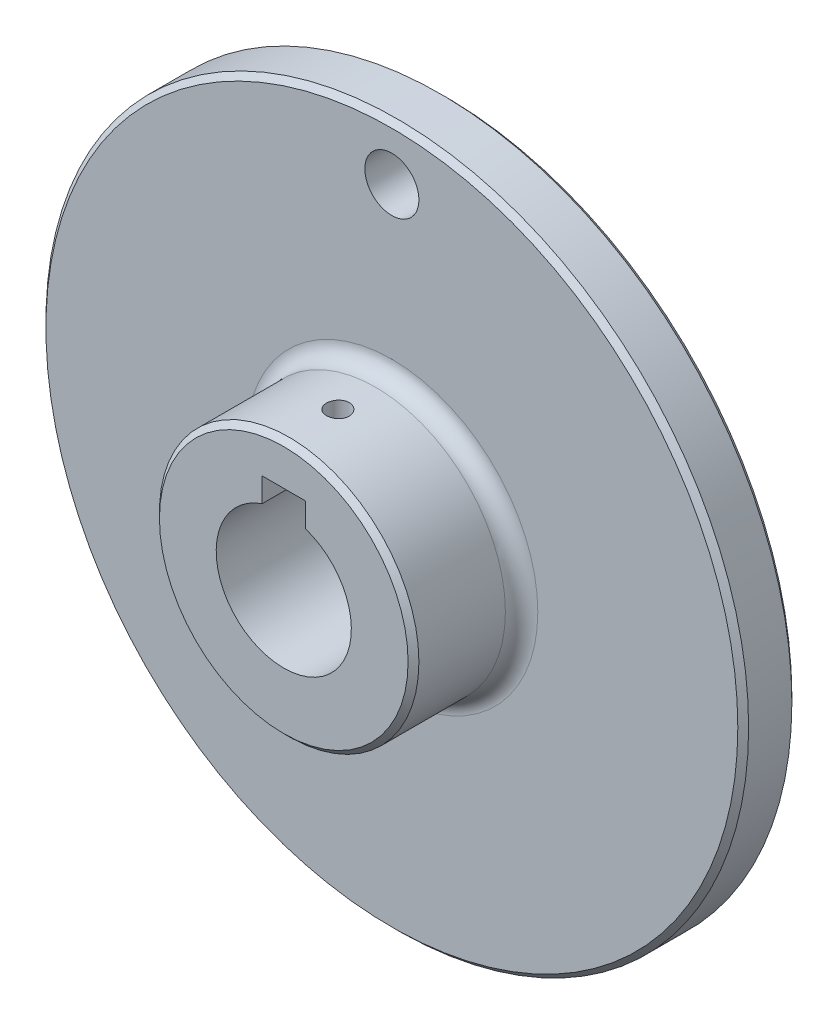
ISO-10303-21;
HEADER;
FILE_DESCRIPTION(('STEP AP214'),'2;1');
FILE_NAME('part.step','',(''),(''),'','','');
FILE_SCHEMA(('AUTOMOTIVE_DESIGN { 1 0 10303 214 1 1 1 1 }'));
ENDSEC;
DATA;
#1=APPLICATION_CONTEXT('core data for automotive mechanical design processes');
#2=APPLICATION_PROTOCOL_DEFINITION('international standard','automotive_design',2000,#1);
#3=PRODUCT_CONTEXT('',#1,'mechanical');
#4=PRODUCT('Part','Part','',(#3));
#5=PRODUCT_RELATED_PRODUCT_CATEGORY('part','',(#4));
#6=PRODUCT_DEFINITION_FORMATION('','',#4);
#7=PRODUCT_DEFINITION_CONTEXT('part definition',#1,'design');
#8=PRODUCT_DEFINITION('design','',#6,#7);
#9=PRODUCT_DEFINITION_SHAPE('','',#8);
#10=(LENGTH_UNIT() NAMED_UNIT(*) SI_UNIT(.MILLI.,.METRE.));
#11=(NAMED_UNIT(*) PLANE_ANGLE_UNIT() SI_UNIT($,.RADIAN.));
#12=(NAMED_UNIT(*) SI_UNIT($,.STERADIAN.) SOLID_ANGLE_UNIT());
#13=UNCERTAINTY_MEASURE_WITH_UNIT(LENGTH_MEASURE(1.E-05),#10,'distance_accuracy_value','');
#14=(GEOMETRIC_REPRESENTATION_CONTEXT(3) GLOBAL_UNCERTAINTY_ASSIGNED_CONTEXT((#13)) GLOBAL_UNIT_ASSIGNED_CONTEXT((#10,
#11,#12)) REPRESENTATION_CONTEXT('',''));
#15=CARTESIAN_POINT('',(0.,0.,0.));
#16=DIRECTION('',(0.,0.,1.));
#17=DIRECTION('',(1.,0.,0.));
#18=AXIS2_PLACEMENT_3D('',#15,#16,#17);
#19=CARTESIAN_POINT('',(0.,0.,10.));
#20=DIRECTION('',(0.,0.,1.));
#21=DIRECTION('',(1.,0.,0.));
#22=AXIS2_PLACEMENT_3D('',#19,#20,#21);
#23=PLANE('',#22);
#24=CARTESIAN_POINT('',(0.,0.,10.));
#25=DIRECTION('',(0.,0.,1.));
#26=DIRECTION('',(1.,0.,0.));
#27=AXIS2_PLACEMENT_3D('',#24,#25,#26);
#28=CIRCLE('',#27,27.);
#29=CARTESIAN_POINT('',(27.,0.,10.));
#30=VERTEX_POINT('',#29);
#31=EDGE_CURVE('E138',#30,#30,#28,.F.);
#32=ORIENTED_EDGE('',*,*,#31,.T.);
#33=EDGE_LOOP('',(#32));
#34=FACE_BOUND('',#33,.T.);
#35=CARTESIAN_POINT('',(0.,0.,10.));
#36=DIRECTION('',(0.,0.,1.));
#37=DIRECTION('',(1.,0.,0.));
#38=AXIS2_PLACEMENT_3D('',#35,#36,#37);
#39=CIRCLE('',#38,64.);
#40=CARTESIAN_POINT('',(64.,0.,10.));
#41=VERTEX_POINT('',#40);
#42=EDGE_CURVE('E132',#41,#41,#39,.T.);
#43=ORIENTED_EDGE('',*,*,#42,.T.);
#44=EDGE_LOOP('',(#43));
#45=FACE_BOUND('',#44,.T.);
#46=CARTESIAN_POINT('',(0.,55.,10.));
#47=DIRECTION('',(0.,0.,1.));
#48=DIRECTION('',(1.,0.,0.));
#49=AXIS2_PLACEMENT_3D('',#46,#47,#48);
#50=CIRCLE('',#49,5.);
#51=CARTESIAN_POINT('',(5.,55.,10.));
#52=VERTEX_POINT('',#51);
#53=EDGE_CURVE('E118',#52,#52,#50,.T.);
#54=ORIENTED_EDGE('',*,*,#53,.F.);
#55=EDGE_LOOP('',(#54));
#56=FACE_BOUND('',#55,.T.);
#57=ADVANCED_FACE('F38',(#34,#45,#56),#23,.T.);
#58=CARTESIAN_POINT('',(0.,0.,0.));
#59=DIRECTION('',(0.,0.,1.));
#60=DIRECTION('',(1.,0.,0.));
#61=AXIS2_PLACEMENT_3D('',#58,#59,#60);
#62=PLANE('',#61);
#63=CARTESIAN_POINT('',(0.,0.,0.));
#64=DIRECTION('',(0.,0.,1.));
#65=DIRECTION('',(1.,0.,0.));
#66=AXIS2_PLACEMENT_3D('',#63,#64,#65);
#67=CIRCLE('',#66,64.);
#68=CARTESIAN_POINT('',(64.,0.,0.));
#69=VERTEX_POINT('',#68);
#70=EDGE_CURVE('E129',#69,#69,#67,.F.);
#71=ORIENTED_EDGE('',*,*,#70,.T.);
#72=EDGE_LOOP('',(#71));
#73=FACE_BOUND('',#72,.T.);
#74=CARTESIAN_POINT('',(0.,55.,0.));
#75=DIRECTION('',(0.,0.,1.));
#76=DIRECTION('',(1.,0.,0.));
#77=AXIS2_PLACEMENT_3D('',#74,#75,#76);
#78=CIRCLE('',#77,5.);
#79=CARTESIAN_POINT('',(5.,55.,0.));
#80=VERTEX_POINT('',#79);
#81=EDGE_CURVE('E117',#80,#80,#78,.T.);
#82=ORIENTED_EDGE('',*,*,#81,.T.);
#83=EDGE_LOOP('',(#82));
#84=FACE_BOUND('',#83,.T.);
#85=DIRECTION('',(-1.,0.,0.));
#86=VECTOR('',#85,1.);
#87=CARTESIAN_POINT('',(-4.,16.3,0.));
#88=LINE('',#87,#86);
#89=CARTESIAN_POINT('',(4.,16.3,0.));
#90=VERTEX_POINT('',#89);
#91=CARTESIAN_POINT('',(-4.,16.3,0.));
#92=VERTEX_POINT('',#91);
#93=EDGE_CURVE('E91',#90,#92,#88,.T.);
#94=ORIENTED_EDGE('',*,*,#93,.T.);
#95=DIRECTION('',(0.,-1.,0.));
#96=VECTOR('',#95,1.);
#97=CARTESIAN_POINT('',(-4.,0.,0.));
#98=LINE('',#97,#96);
#99=CARTESIAN_POINT('',(-4.,11.842719282327,0.));
#100=VERTEX_POINT('',#99);
#101=EDGE_CURVE('E101',#92,#100,#98,.T.);
#102=ORIENTED_EDGE('',*,*,#101,.T.);
#103=CARTESIAN_POINT('',(0.,0.,0.));
#104=DIRECTION('',(0.,0.,1.));
#105=DIRECTION('',(1.,0.,0.));
#106=AXIS2_PLACEMENT_3D('',#103,#104,#105);
#107=CIRCLE('',#106,12.5);
#108=CARTESIAN_POINT('',(4.,11.842719282327,0.));
#109=VERTEX_POINT('',#108);
#110=EDGE_CURVE('E100',#100,#109,#107,.T.);
#111=ORIENTED_EDGE('',*,*,#110,.T.);
#112=DIRECTION('',(0.,1.,0.));
#113=VECTOR('',#112,1.);
#114=CARTESIAN_POINT('',(4.,0.,0.));
#115=LINE('',#114,#113);
#116=EDGE_CURVE('E86',#109,#90,#115,.T.);
#117=ORIENTED_EDGE('',*,*,#116,.T.);
#118=EDGE_LOOP('',(#94,#102,#111,#117));
#119=FACE_BOUND('',#118,.T.);
#120=ADVANCED_FACE('F98',(#73,#84,#119),#62,.F.);
#121=CARTESIAN_POINT('',(0.,0.,10.));
#122=DIRECTION('',(0.,0.,-1.));
#123=DIRECTION('',(-1.,0.,0.));
#124=AXIS2_PLACEMENT_3D('',#121,#122,#123);
#125=CYLINDRICAL_SURFACE('',#124,65.);
#126=CARTESIAN_POINT('',(0.,0.,1.));
#127=DIRECTION('',(0.,0.,1.));
#128=DIRECTION('',(1.,0.,0.));
#129=AXIS2_PLACEMENT_3D('',#126,#127,#128);
#130=CIRCLE('',#129,65.);
#131=CARTESIAN_POINT('',(65.,0.,1.));
#132=VERTEX_POINT('',#131);
#133=EDGE_CURVE('E126',#132,#132,#130,.T.);
#134=ORIENTED_EDGE('',*,*,#133,.T.);
#135=EDGE_LOOP('',(#134));
#136=FACE_BOUND('',#135,.T.);
#137=CARTESIAN_POINT('',(0.,0.,8.99999999999997));
#138=DIRECTION('',(0.,0.,1.));
#139=DIRECTION('',(1.,0.,0.));
#140=AXIS2_PLACEMENT_3D('',#137,#138,#139);
#141=CIRCLE('',#140,65.);
#142=CARTESIAN_POINT('',(65.,0.,8.99999999999997));
#143=VERTEX_POINT('',#142);
#144=EDGE_CURVE('E121',#143,#143,#141,.F.);
#145=ORIENTED_EDGE('',*,*,#144,.T.);
#146=EDGE_LOOP('',(#145));
#147=FACE_BOUND('',#146,.T.);
#148=ADVANCED_FACE('F178',(#136,#147),#125,.T.);
#149=CARTESIAN_POINT('',(0.,55.,10.));
#150=DIRECTION('',(0.,0.,-1.));
#151=DIRECTION('',(-1.,0.,0.));
#152=AXIS2_PLACEMENT_3D('',#149,#150,#151);
#153=CYLINDRICAL_SURFACE('',#152,5.);
#154=ORIENTED_EDGE('',*,*,#53,.T.);
#155=EDGE_LOOP('',(#154));
#156=FACE_BOUND('',#155,.T.);
#157=ORIENTED_EDGE('',*,*,#81,.F.);
#158=EDGE_LOOP('',(#157));
#159=FACE_BOUND('',#158,.T.);
#160=ADVANCED_FACE('F167',(#156,#159),#153,.F.);
#161=CARTESIAN_POINT('',(0.,0.,10.));
#162=DIRECTION('',(0.,0.,-1.));
#163=DIRECTION('',(-1.,0.,0.));
#164=AXIS2_PLACEMENT_3D('',#161,#162,#163);
#165=CYLINDRICAL_SURFACE('',#164,12.5);
#166=DIRECTION('',(0.,0.,-1.));
#167=VECTOR('',#166,1.);
#168=CARTESIAN_POINT('',(-4.,11.842719282327,10.));
#169=LINE('',#168,#167);
#170=CARTESIAN_POINT('',(-4.,11.842719282327,30.));
#171=VERTEX_POINT('',#170);
#172=EDGE_CURVE('E65',#171,#100,#169,.T.);
#173=ORIENTED_EDGE('',*,*,#172,.F.);
#174=CARTESIAN_POINT('',(0.,0.,30.));
#175=DIRECTION('',(0.,0.,1.));
#176=DIRECTION('',(1.,0.,0.));
#177=AXIS2_PLACEMENT_3D('',#174,#175,#176);
#178=CIRCLE('',#177,12.5);
#179=CARTESIAN_POINT('',(4.,11.842719282327,30.));
#180=VERTEX_POINT('',#179);
#181=EDGE_CURVE('E113',#171,#180,#178,.T.);
#182=ORIENTED_EDGE('',*,*,#181,.T.);
#183=DIRECTION('',(0.,0.,-1.));
#184=VECTOR('',#183,1.);
#185=CARTESIAN_POINT('',(4.,11.842719282327,10.));
#186=LINE('',#185,#184);
#187=EDGE_CURVE('E57',#109,#180,#186,.F.);
#188=ORIENTED_EDGE('',*,*,#187,.F.);
#189=ORIENTED_EDGE('',*,*,#110,.F.);
#190=EDGE_LOOP('',(#173,#182,#188,#189));
#191=FACE_BOUND('',#190,.T.);
#192=ADVANCED_FACE('F158',(#191),#165,.F.);
#193=CARTESIAN_POINT('',(0.,0.,30.));
#194=DIRECTION('',(0.,0.,1.));
#195=DIRECTION('',(1.,0.,0.));
#196=AXIS2_PLACEMENT_3D('',#193,#194,#195);
#197=PLANE('',#196);
#198=DIRECTION('',(0.,-1.,0.));
#199=VECTOR('',#198,1.);
#200=CARTESIAN_POINT('',(-4.,0.,30.));
#201=LINE('',#200,#199);
#202=CARTESIAN_POINT('',(-4.,16.3,30.));
#203=VERTEX_POINT('',#202);
#204=EDGE_CURVE('E107',#203,#171,#201,.T.);
#205=ORIENTED_EDGE('',*,*,#204,.F.);
#206=DIRECTION('',(-1.,0.,0.));
#207=VECTOR('',#206,1.);
#208=CARTESIAN_POINT('',(-4.,16.3,30.));
#209=LINE('',#208,#207);
#210=CARTESIAN_POINT('',(4.,16.3,30.));
#211=VERTEX_POINT('',#210);
#212=EDGE_CURVE('E103',#211,#203,#209,.T.);
#213=ORIENTED_EDGE('',*,*,#212,.F.);
#214=DIRECTION('',(0.,1.,0.));
#215=VECTOR('',#214,1.);
#216=CARTESIAN_POINT('',(4.,0.,30.));
#217=LINE('',#216,#215);
#218=EDGE_CURVE('E11',#180,#211,#217,.T.);
#219=ORIENTED_EDGE('',*,*,#218,.F.);
#220=ORIENTED_EDGE('',*,*,#181,.F.);
#221=EDGE_LOOP('',(#205,#213,#219,#220));
#222=FACE_BOUND('',#221,.T.);
#223=CARTESIAN_POINT('',(0.,0.,30.));
#224=DIRECTION('',(0.,0.,1.));
#225=DIRECTION('',(1.,0.,0.));
#226=AXIS2_PLACEMENT_3D('',#223,#224,#225);
#227=CIRCLE('',#226,23.);
#228=CARTESIAN_POINT('',(23.,0.,30.));
#229=VERTEX_POINT('',#228);
#230=EDGE_CURVE('E141',#229,#229,#227,.T.);
#231=ORIENTED_EDGE('',*,*,#230,.T.);
#232=EDGE_LOOP('',(#231));
#233=FACE_BOUND('',#232,.T.);
#234=ADVANCED_FACE('F156',(#222,#233),#197,.T.);
#235=CARTESIAN_POINT('',(0.,0.,30.));
#236=DIRECTION('',(0.,0.,-1.));
#237=DIRECTION('',(-1.,0.,0.));
#238=AXIS2_PLACEMENT_3D('',#235,#236,#237);
#239=CYLINDRICAL_SURFACE('',#238,24.);
#240=CARTESIAN_POINT('',(0.,24.,17.9));
#241=CARTESIAN_POINT('',(0.117716394273765,23.9999988006224,17.9000051318366));
#242=CARTESIAN_POINT('',(0.235512387593384,23.9991247023993,17.9099312649864));
#243=CARTESIAN_POINT('',(0.467843662284281,23.9957217954763,17.9493815556457));
#244=CARTESIAN_POINT('',(0.582375121675826,23.9931911241804,17.9789277738711));
#245=CARTESIAN_POINT('',(0.804778935039247,23.9867609769263,18.0567559377976));
#246=CARTESIAN_POINT('',(0.912655075006092,23.9828622877908,18.1050271154196));
#247=CARTESIAN_POINT('',(1.11874853561018,23.9741330243075,18.2189152993034));
#248=CARTESIAN_POINT('',(1.21696788237025,23.9693026460731,18.2845286562455));
#249=CARTESIAN_POINT('',(1.40125935168274,23.9592367253399,18.4314362903589));
#250=CARTESIAN_POINT('',(1.48730075662728,23.9540002080924,18.5127690385699));
#251=CARTESIAN_POINT('',(1.64453026420101,23.9437203480448,18.6887252070973));
#252=CARTESIAN_POINT('',(1.71571770648782,23.9386770138409,18.7833492179725));
#253=CARTESIAN_POINT('',(1.84132380483458,23.9293442085367,18.9833895521073));
#254=CARTESIAN_POINT('',(1.8957152516902,23.925055965449,19.0888230223323));
#255=CARTESIAN_POINT('',(1.98601159904577,23.9177302898779,19.3073700515384));
#256=CARTESIAN_POINT('',(2.0219168562581,23.9146928332594,19.4204834622785));
#257=CARTESIAN_POINT('',(2.07413198090787,23.9102210076511,19.650870202076));
#258=CARTESIAN_POINT('',(2.09049214167513,23.9087825248583,19.7681320514263));
#259=CARTESIAN_POINT('',(2.10330806190027,23.9076585794133,20.0037454978772));
#260=CARTESIAN_POINT('',(2.09976422970633,23.9079730807971,20.1220970725713));
#261=CARTESIAN_POINT('',(2.07291429866956,23.9103158254927,20.3561852734459));
#262=CARTESIAN_POINT('',(2.04966291757721,23.912339323742,20.47192822989));
#263=CARTESIAN_POINT('',(1.98414295005452,23.9178646298535,20.6978624446621));
#264=CARTESIAN_POINT('',(1.94187416121935,23.9213664534498,20.8080536438881));
#265=CARTESIAN_POINT('',(1.83945817169241,23.9294593049072,21.0199304410712));
#266=CARTESIAN_POINT('',(1.77928648529793,23.9340518227583,21.1216041440255));
#267=CARTESIAN_POINT('',(1.64279039172105,23.943807254894,21.3134297053904));
#268=CARTESIAN_POINT('',(1.56646562341553,23.9489701819297,21.4035813061371));
#269=CARTESIAN_POINT('',(1.39952334874021,23.9593058190254,21.5701217004971));
#270=CARTESIAN_POINT('',(1.30885854945089,23.9644785034316,21.6464630966947));
#271=CARTESIAN_POINT('',(1.11597466533696,23.9742342857835,21.7828493534128));
#272=CARTESIAN_POINT('',(1.01375557171062,23.9788173832801,21.842894201519));
#273=CARTESIAN_POINT('',(0.800633442206537,23.9868786139962,21.9449802032462));
#274=CARTESIAN_POINT('',(0.689729361340354,23.9903566139936,21.9870191864302));
#275=CARTESIAN_POINT('',(0.462399870272175,23.995814292173,22.0518665799287));
#276=CARTESIAN_POINT('',(0.345974586480156,23.9977940046413,22.0746754302999));
#277=CARTESIAN_POINT('',(0.111318322445606,24.0000276476427,22.1003555091976));
#278=CARTESIAN_POINT('',(-0.00690544315073173,24.0002872436954,22.1032921910439));
#279=CARTESIAN_POINT('',(-0.242163584876059,23.9990665500727,22.089316140208));
#280=CARTESIAN_POINT('',(-0.359197973241963,23.9975862783162,22.0724036119535));
#281=CARTESIAN_POINT('',(-0.588568020671695,23.9930559306374,22.0192634875853));
#282=CARTESIAN_POINT('',(-0.70091077813124,23.9900083265439,21.9830663019492));
#283=CARTESIAN_POINT('',(-0.917928624548868,23.9826855627066,21.8924154730501));
#284=CARTESIAN_POINT('',(-1.022603580266,23.9784103816378,21.8379615126367));
#285=CARTESIAN_POINT('',(-1.22161190226636,23.969097343059,21.7121789015617));
#286=CARTESIAN_POINT('',(-1.31591782222338,23.9640575416552,21.6408069725735));
#287=CARTESIAN_POINT('',(-1.49123384005497,23.9537877725258,21.4832768203147));
#288=CARTESIAN_POINT('',(-1.57224368311952,23.9485578011581,21.3971183137345));
#289=CARTESIAN_POINT('',(-1.71889313234217,23.9384803051094,21.2121763349464));
#290=CARTESIAN_POINT('',(-1.78448996866652,23.9336338688238,21.1133588809092));
#291=CARTESIAN_POINT('',(-1.89815791660644,23.9248878861238,20.9060728592356));
#292=CARTESIAN_POINT('',(-1.94622921851035,23.9209883294287,20.7976043964035));
#293=CARTESIAN_POINT('',(-2.02340896622173,23.9145839223568,20.5742457082));
#294=CARTESIAN_POINT('',(-2.05254342235981,23.9120771596259,20.4593645275638));
#295=CARTESIAN_POINT('',(-2.09110707718806,23.9087358882754,20.2263180065768));
#296=CARTESIAN_POINT('',(-2.10053669753482,23.9079013438726,20.1081527365559));
#297=CARTESIAN_POINT('',(-2.09941791395517,23.9079995810981,19.8723173655387));
#298=CARTESIAN_POINT('',(-2.08893670635699,23.9089264183078,19.7546469374733));
#299=CARTESIAN_POINT('',(-2.04843408795103,23.9124303475859,19.5227446551525));
#300=CARTESIAN_POINT('',(-2.01841264896971,23.9150074420336,19.4085128058552));
#301=CARTESIAN_POINT('',(-1.93969915712925,23.9215199291297,19.1867270970379));
#302=CARTESIAN_POINT('',(-1.89100850008002,23.9254552202299,19.0791727389717));
#303=CARTESIAN_POINT('',(-1.77634607254446,23.9342408763921,18.8737536329814));
#304=CARTESIAN_POINT('',(-1.71037453239123,23.9390912292572,18.7758887559324));
#305=CARTESIAN_POINT('',(-1.5627704117088,23.9491800084125,18.5922825410121));
#306=CARTESIAN_POINT('',(-1.48108797052065,23.9544196367282,18.5065813528558));
#307=CARTESIAN_POINT('',(-1.30447369398219,23.964685594958,18.3500691258395));
#308=CARTESIAN_POINT('',(-1.20953866528953,23.9697118730815,18.2792616861149));
#309=CARTESIAN_POINT('',(-1.00891313664468,23.9789947999307,18.1544416799836));
#310=CARTESIAN_POINT('',(-0.903201383225725,23.9832498799849,18.1004631878278));
#311=CARTESIAN_POINT('',(-0.68424870905949,23.9904929625438,18.0110921028839));
#312=CARTESIAN_POINT('',(-0.571016572702815,23.9934824143027,17.9756782408481));
#313=CARTESIAN_POINT('',(-0.380935495197685,23.997093754937,17.9334170627056));
#314=CARTESIAN_POINT('',(-0.305307361806823,23.9981786074204,17.9209024281304));
#315=CARTESIAN_POINT('',(-0.153130713488119,23.9996321190216,17.9041922398746));
#316=CARTESIAN_POINT('',(-0.0765822013034638,24.0000007802735,17.8999966614052));
#317=CARTESIAN_POINT('',(0.,24.,17.9));
#318=B_SPLINE_CURVE_WITH_KNOTS('',3,(#240,#241,#242,#243,#244,#245,#246,#247,#248,#249,#250,
#251,#252,#253,#254,#255,#256,#257,#258,#259,#260,#261,#262,#263,#264,#265,#266,#267,#268,#269,
#270,#271,#272,#273,#274,#275,#276,#277,#278,#279,#280,#281,#282,#283,#284,#285,#286,#287,#288,
#289,#290,#291,#292,#293,#294,#295,#296,#297,#298,#299,#300,#301,#302,#303,#304,#305,#306,#307,
#308,#309,#310,#311,#312,#313,#314,#315,#316,#317),.UNSPECIFIED.,.T.,.F.,(4,2,2,2,2,2,2,2,2,2,2,
2,2,2,2,2,2,2,2,2,2,2,2,2,2,2,2,2,2,2,2,2,2,2,2,2,2,2,4),(0.,0.352869564684392,
0.706136567316276,1.05920071871515,1.4121906337954,1.76605563987223,2.11993637389321,
2.47438741662,2.82883161954796,3.18236179060076,3.53588470869325,3.88842927828893,
4.24097760015262,4.5940103345859,4.94705096235828,5.30128116293908,5.65551163336423,
6.00978479091917,6.36404984117194,6.71714747185292,7.07024146600174,7.42278029800202,
7.77532525450491,8.12878198857481,8.48224549560543,8.83667854749042,9.19110775090581,
9.54504910054652,9.8989828762477,10.2517242954069,10.6044662231578,10.9571817831893,
11.3098926421916,11.6637419185658,12.0176766060804,12.3723233340745,12.7265628551353,
12.9561282332379,13.1856929272913),.UNSPECIFIED.);
#319=CARTESIAN_POINT('',(0.,24.,17.9));
#320=VERTEX_POINT('',#319);
#321=EDGE_CURVE('E42',#320,#320,#318,.T.);
#322=ORIENTED_EDGE('',*,*,#321,.T.);
#323=EDGE_LOOP('',(#322));
#324=FACE_BOUND('',#323,.T.);
#325=CARTESIAN_POINT('',(0.,0.,29.));
#326=DIRECTION('',(0.,0.,1.));
#327=DIRECTION('',(1.,0.,0.));
#328=AXIS2_PLACEMENT_3D('',#325,#326,#327);
#329=CIRCLE('',#328,24.);
#330=CARTESIAN_POINT('',(24.,0.,29.));
#331=VERTEX_POINT('',#330);
#332=EDGE_CURVE('E51',#331,#331,#329,.F.);
#333=ORIENTED_EDGE('',*,*,#332,.T.);
#334=EDGE_LOOP('',(#333));
#335=FACE_BOUND('',#334,.T.);
#336=CARTESIAN_POINT('',(0.,0.,13.));
#337=DIRECTION('',(0.,0.,1.));
#338=DIRECTION('',(1.,0.,0.));
#339=AXIS2_PLACEMENT_3D('',#336,#337,#338);
#340=CIRCLE('',#339,24.);
#341=CARTESIAN_POINT('',(24.,0.,13.));
#342=VERTEX_POINT('',#341);
#343=EDGE_CURVE('E135',#342,#342,#340,.T.);
#344=ORIENTED_EDGE('',*,*,#343,.T.);
#345=EDGE_LOOP('',(#344));
#346=FACE_BOUND('',#345,.T.);
#347=ADVANCED_FACE('F147',(#324,#335,#346),#239,.T.);
#348=CARTESIAN_POINT('',(0.,0.,1.));
#349=DIRECTION('',(0.,0.,1.));
#350=DIRECTION('',(1.,0.,0.));
#351=AXIS2_PLACEMENT_3D('',#348,#349,#350);
#352=CONICAL_SURFACE('',#351,65.,0.785398163397455);
#353=ORIENTED_EDGE('',*,*,#70,.F.);
#354=EDGE_LOOP('',(#353));
#355=FACE_BOUND('',#354,.T.);
#356=ORIENTED_EDGE('',*,*,#133,.F.);
#357=EDGE_LOOP('',(#356));
#358=FACE_BOUND('',#357,.T.);
#359=ADVANCED_FACE('F165',(#355,#358),#352,.T.);
#360=CARTESIAN_POINT('',(0.,0.,10.));
#361=DIRECTION('',(0.,0.,-1.));
#362=DIRECTION('',(-1.,0.,0.));
#363=AXIS2_PLACEMENT_3D('',#360,#361,#362);
#364=CONICAL_SURFACE('',#363,64.,0.785398163397435);
#365=ORIENTED_EDGE('',*,*,#144,.F.);
#366=EDGE_LOOP('',(#365));
#367=FACE_BOUND('',#366,.T.);
#368=ORIENTED_EDGE('',*,*,#42,.F.);
#369=EDGE_LOOP('',(#368));
#370=FACE_BOUND('',#369,.T.);
#371=ADVANCED_FACE('F189',(#367,#370),#364,.T.);
#372=CARTESIAN_POINT('',(0.,0.,13.));
#373=DIRECTION('',(0.,0.,1.));
#374=DIRECTION('',(1.,0.,0.));
#375=AXIS2_PLACEMENT_3D('',#372,#373,#374);
#376=TOROIDAL_SURFACE('',#375,27.,3.);
#377=ORIENTED_EDGE('',*,*,#31,.F.);
#378=EDGE_LOOP('',(#377));
#379=FACE_BOUND('',#378,.T.);
#380=ORIENTED_EDGE('',*,*,#343,.F.);
#381=EDGE_LOOP('',(#380));
#382=FACE_BOUND('',#381,.T.);
#383=ADVANCED_FACE('F153',(#379,#382),#376,.F.);
#384=CARTESIAN_POINT('',(0.,0.,30.));
#385=DIRECTION('',(0.,0.,-1.));
#386=DIRECTION('',(-1.,0.,0.));
#387=AXIS2_PLACEMENT_3D('',#384,#385,#386);
#388=CONICAL_SURFACE('',#387,23.,0.78539816339746);
#389=ORIENTED_EDGE('',*,*,#332,.F.);
#390=EDGE_LOOP('',(#389));
#391=FACE_BOUND('',#390,.T.);
#392=ORIENTED_EDGE('',*,*,#230,.F.);
#393=EDGE_LOOP('',(#392));
#394=FACE_BOUND('',#393,.T.);
#395=ADVANCED_FACE('F40',(#391,#394),#388,.T.);
#396=CARTESIAN_POINT('',(-4.,0.,0.));
#397=DIRECTION('',(-1.,0.,0.));
#398=DIRECTION('',(0.,0.,1.));
#399=AXIS2_PLACEMENT_3D('',#396,#397,#398);
#400=PLANE('',#399);
#401=ORIENTED_EDGE('',*,*,#172,.T.);
#402=ORIENTED_EDGE('',*,*,#101,.F.);
#403=DIRECTION('',(0.,0.,1.));
#404=VECTOR('',#403,1.);
#405=CARTESIAN_POINT('',(-4.,16.3,0.));
#406=LINE('',#405,#404);
#407=EDGE_CURVE('E90',#92,#203,#406,.T.);
#408=ORIENTED_EDGE('',*,*,#407,.T.);
#409=ORIENTED_EDGE('',*,*,#204,.T.);
#410=EDGE_LOOP('',(#401,#402,#408,#409));
#411=FACE_BOUND('',#410,.T.);
#412=ADVANCED_FACE('F152',(#411),#400,.F.);
#413=CARTESIAN_POINT('',(-4.,16.3,0.));
#414=DIRECTION('',(0.,1.,0.));
#415=DIRECTION('',(0.,0.,1.));
#416=AXIS2_PLACEMENT_3D('',#413,#414,#415);
#417=PLANE('',#416);
#418=CARTESIAN_POINT('',(0.,16.3,20.));
#419=DIRECTION('',(0.,-1.,0.));
#420=DIRECTION('',(0.,0.,-1.));
#421=AXIS2_PLACEMENT_3D('',#418,#419,#420);
#422=CIRCLE('',#421,2.09999999999999);
#423=CARTESIAN_POINT('',(0.,16.3,17.9));
#424=VERTEX_POINT('',#423);
#425=EDGE_CURVE('E311',#424,#424,#422,.T.);
#426=ORIENTED_EDGE('',*,*,#425,.F.);
#427=EDGE_LOOP('',(#426));
#428=FACE_BOUND('',#427,.T.);
#429=ORIENTED_EDGE('',*,*,#212,.T.);
#430=ORIENTED_EDGE('',*,*,#407,.F.);
#431=ORIENTED_EDGE('',*,*,#93,.F.);
#432=DIRECTION('',(0.,0.,1.));
#433=VECTOR('',#432,1.);
#434=CARTESIAN_POINT('',(4.,16.3,0.));
#435=LINE('',#434,#433);
#436=EDGE_CURVE('E82',#90,#211,#435,.T.);
#437=ORIENTED_EDGE('',*,*,#436,.T.);
#438=EDGE_LOOP('',(#429,#430,#431,#437));
#439=FACE_BOUND('',#438,.T.);
#440=ADVANCED_FACE('F94',(#428,#439),#417,.F.);
#441=CARTESIAN_POINT('',(4.,0.,0.));
#442=DIRECTION('',(1.,0.,0.));
#443=DIRECTION('',(0.,0.,-1.));
#444=AXIS2_PLACEMENT_3D('',#441,#442,#443);
#445=PLANE('',#444);
#446=ORIENTED_EDGE('',*,*,#187,.T.);
#447=ORIENTED_EDGE('',*,*,#218,.T.);
#448=ORIENTED_EDGE('',*,*,#436,.F.);
#449=ORIENTED_EDGE('',*,*,#116,.F.);
#450=EDGE_LOOP('',(#446,#447,#448,#449));
#451=FACE_BOUND('',#450,.T.);
#452=ADVANCED_FACE('F84',(#451),#445,.F.);
#453=CARTESIAN_POINT('',(0.,16.3,20.));
#454=DIRECTION('',(0.,-1.,0.));
#455=DIRECTION('',(0.,0.,-1.));
#456=AXIS2_PLACEMENT_3D('',#453,#454,#455);
#457=CYLINDRICAL_SURFACE('',#456,2.09999999999999);
#458=ORIENTED_EDGE('',*,*,#425,.T.);
#459=EDGE_LOOP('',(#458));
#460=FACE_BOUND('',#459,.T.);
#461=ORIENTED_EDGE('',*,*,#321,.F.);
#462=EDGE_LOOP('',(#461));
#463=FACE_BOUND('',#462,.T.);
#464=ADVANCED_FACE('F227',(#460,#463),#457,.F.);
#465=CLOSED_SHELL('',(#57,#120,#148,#160,#192,#234,#347,#359,#371,#383,#395,#412,#440,#452,#464));
#466=MANIFOLD_SOLID_BREP('B2',#465);
#467=ADVANCED_BREP_SHAPE_REPRESENTATION('',(#18,#466),#14);
#468=SHAPE_DEFINITION_REPRESENTATION(#9,#467);
ENDSEC;
END-ISO-10303-21;
